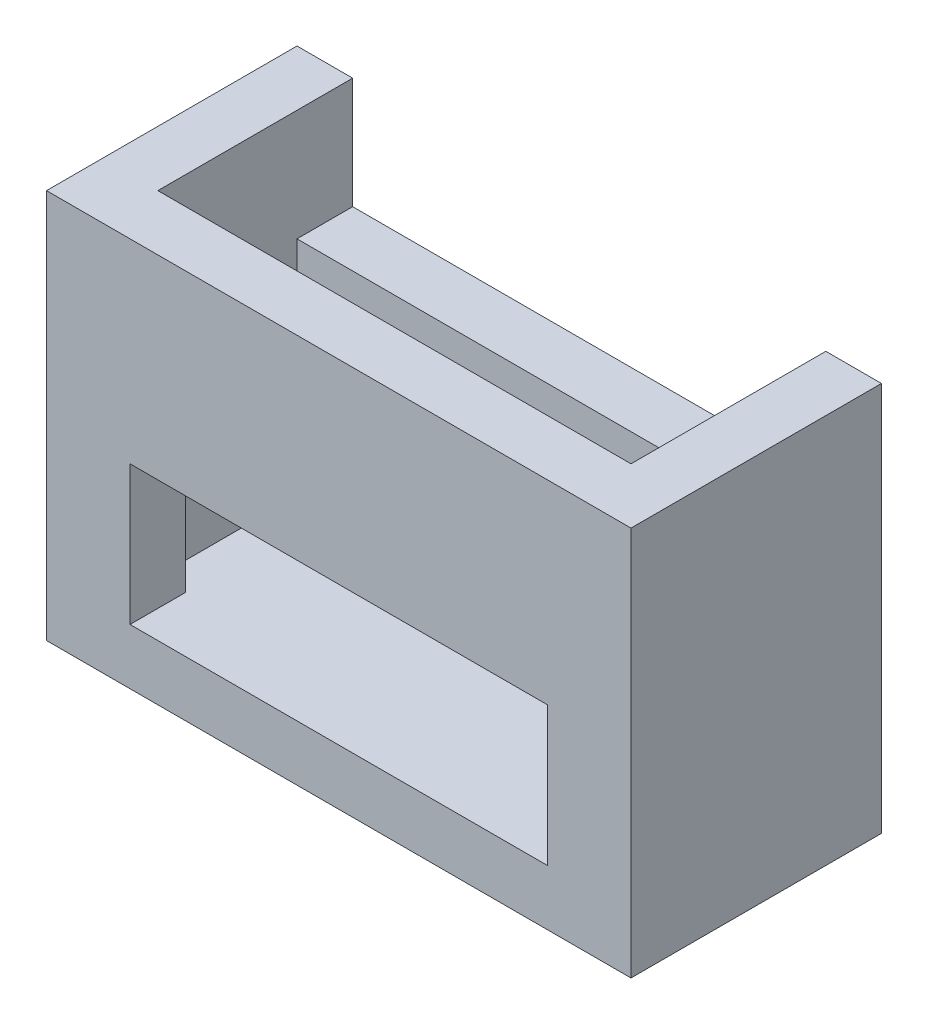
ISO-10303-21;
HEADER;
FILE_DESCRIPTION(('STEP AP214'),'2;1');
FILE_NAME('part.step','',(''),(''),'','','');
FILE_SCHEMA(('AUTOMOTIVE_DESIGN { 1 0 10303 214 1 1 1 1 }'));
ENDSEC;
DATA;
#1=APPLICATION_CONTEXT('core data for automotive mechanical design processes');
#2=APPLICATION_PROTOCOL_DEFINITION('international standard','automotive_design',2000,#1);
#3=PRODUCT_CONTEXT('',#1,'mechanical');
#4=PRODUCT('Part','Part','',(#3));
#5=PRODUCT_RELATED_PRODUCT_CATEGORY('part','',(#4));
#6=PRODUCT_DEFINITION_FORMATION('','',#4);
#7=PRODUCT_DEFINITION_CONTEXT('part definition',#1,'design');
#8=PRODUCT_DEFINITION('design','',#6,#7);
#9=PRODUCT_DEFINITION_SHAPE('','',#8);
#10=(LENGTH_UNIT() NAMED_UNIT(*) SI_UNIT(.MILLI.,.METRE.));
#11=(NAMED_UNIT(*) PLANE_ANGLE_UNIT() SI_UNIT($,.RADIAN.));
#12=(NAMED_UNIT(*) SI_UNIT($,.STERADIAN.) SOLID_ANGLE_UNIT());
#13=UNCERTAINTY_MEASURE_WITH_UNIT(LENGTH_MEASURE(1.E-05),#10,'distance_accuracy_value','');
#14=(GEOMETRIC_REPRESENTATION_CONTEXT(3) GLOBAL_UNCERTAINTY_ASSIGNED_CONTEXT((#13)) GLOBAL_UNIT_ASSIGNED_CONTEXT((#10,
#11,#12)) REPRESENTATION_CONTEXT('',''));
#15=CARTESIAN_POINT('',(0.,0.,0.));
#16=DIRECTION('',(0.,0.,1.));
#17=DIRECTION('',(1.,0.,0.));
#18=AXIS2_PLACEMENT_3D('',#15,#16,#17);
#19=CARTESIAN_POINT('',(7.50000000000001,0.,4.));
#20=DIRECTION('',(1.,0.,0.));
#21=DIRECTION('',(0.,0.,-1.));
#22=AXIS2_PLACEMENT_3D('',#19,#20,#21);
#23=PLANE('',#22);
#24=DIRECTION('',(0.,-1.,0.));
#25=VECTOR('',#24,1.);
#26=CARTESIAN_POINT('',(7.50000000000001,0.,7.));
#27=LINE('',#26,#25);
#28=CARTESIAN_POINT('',(7.50000000000001,0.,7.));
#29=VERTEX_POINT('',#28);
#30=CARTESIAN_POINT('',(7.50000000000001,-5.,7.));
#31=VERTEX_POINT('',#30);
#32=EDGE_CURVE('E270',#29,#31,#27,.T.);
#33=ORIENTED_EDGE('',*,*,#32,.T.);
#34=DIRECTION('',(0.,0.,1.));
#35=VECTOR('',#34,1.);
#36=CARTESIAN_POINT('',(7.50000000000001,-5.,4.));
#37=LINE('',#36,#35);
#38=CARTESIAN_POINT('',(7.50000000000001,-5.,9.));
#39=VERTEX_POINT('',#38);
#40=EDGE_CURVE('E191',#31,#39,#37,.T.);
#41=ORIENTED_EDGE('',*,*,#40,.T.);
#42=DIRECTION('',(0.,1.,0.));
#43=VECTOR('',#42,1.);
#44=CARTESIAN_POINT('',(7.50000000000001,0.,9.));
#45=LINE('',#44,#43);
#46=CARTESIAN_POINT('',(7.50000000000001,0.,9.));
#47=VERTEX_POINT('',#46);
#48=EDGE_CURVE('E254',#39,#47,#45,.T.);
#49=ORIENTED_EDGE('',*,*,#48,.T.);
#50=DIRECTION('',(0.,0.,1.));
#51=VECTOR('',#50,1.);
#52=CARTESIAN_POINT('',(7.50000000000001,0.,4.));
#53=LINE('',#52,#51);
#54=EDGE_CURVE('E185',#29,#47,#53,.T.);
#55=ORIENTED_EDGE('',*,*,#54,.F.);
#56=EDGE_LOOP('',(#33,#41,#49,#55));
#57=FACE_BOUND('',#56,.T.);
#58=ADVANCED_FACE('F39',(#57),#23,.F.);
#59=CARTESIAN_POINT('',(0.,-1.,0.));
#60=DIRECTION('',(0.,1.,0.));
#61=DIRECTION('',(0.,0.,1.));
#62=AXIS2_PLACEMENT_3D('',#59,#60,#61);
#63=PLANE('',#62);
#64=DIRECTION('',(0.,0.,1.));
#65=VECTOR('',#64,1.);
#66=CARTESIAN_POINT('',(-8.5,-1.,0.));
#67=LINE('',#66,#65);
#68=CARTESIAN_POINT('',(-8.5,-1.,2.));
#69=VERTEX_POINT('',#68);
#70=CARTESIAN_POINT('',(-8.5,-1.,4.));
#71=VERTEX_POINT('',#70);
#72=EDGE_CURVE('E285',#69,#71,#67,.T.);
#73=ORIENTED_EDGE('',*,*,#72,.T.);
#74=DIRECTION('',(-1.,0.,0.));
#75=VECTOR('',#74,1.);
#76=CARTESIAN_POINT('',(0.,-1.,4.));
#77=LINE('',#76,#75);
#78=CARTESIAN_POINT('',(8.5,-1.,4.));
#79=VERTEX_POINT('',#78);
#80=EDGE_CURVE('E11',#79,#71,#77,.T.);
#81=ORIENTED_EDGE('',*,*,#80,.F.);
#82=DIRECTION('',(0.,0.,-1.));
#83=VECTOR('',#82,1.);
#84=CARTESIAN_POINT('',(8.5,-1.,0.));
#85=LINE('',#84,#83);
#86=CARTESIAN_POINT('',(8.5,-1.,2.));
#87=VERTEX_POINT('',#86);
#88=EDGE_CURVE('E279',#79,#87,#85,.T.);
#89=ORIENTED_EDGE('',*,*,#88,.T.);
#90=DIRECTION('',(-1.,0.,0.));
#91=VECTOR('',#90,1.);
#92=CARTESIAN_POINT('',(0.,-1.,2.));
#93=LINE('',#92,#91);
#94=EDGE_CURVE('E281',#87,#69,#93,.T.);
#95=ORIENTED_EDGE('',*,*,#94,.T.);
#96=EDGE_LOOP('',(#73,#81,#89,#95));
#97=FACE_BOUND('',#96,.T.);
#98=ADVANCED_FACE('F314',(#97),#63,.T.);
#99=CARTESIAN_POINT('',(0.,0.,4.));
#100=DIRECTION('',(0.,0.,1.));
#101=DIRECTION('',(1.,0.,0.));
#102=AXIS2_PLACEMENT_3D('',#99,#100,#101);
#103=PLANE('',#102);
#104=DIRECTION('',(1.,0.,0.));
#105=VECTOR('',#104,1.);
#106=CARTESIAN_POINT('',(0.,-5.,4.));
#107=LINE('',#106,#105);
#108=CARTESIAN_POINT('',(-8.5,-5.,4.));
#109=VERTEX_POINT('',#108);
#110=CARTESIAN_POINT('',(8.5,-5.,4.));
#111=VERTEX_POINT('',#110);
#112=EDGE_CURVE('E193',#109,#111,#107,.T.);
#113=ORIENTED_EDGE('',*,*,#112,.T.);
#114=DIRECTION('',(0.,1.,0.));
#115=VECTOR('',#114,1.);
#116=CARTESIAN_POINT('',(8.5,-5.,4.));
#117=LINE('',#116,#115);
#118=EDGE_CURVE('E275',#111,#79,#117,.T.);
#119=ORIENTED_EDGE('',*,*,#118,.T.);
#120=ORIENTED_EDGE('',*,*,#80,.T.);
#121=DIRECTION('',(0.,1.,0.));
#122=VECTOR('',#121,1.);
#123=CARTESIAN_POINT('',(-8.5,-5.,4.));
#124=LINE('',#123,#122);
#125=EDGE_CURVE('E289',#109,#71,#124,.T.);
#126=ORIENTED_EDGE('',*,*,#125,.F.);
#127=EDGE_LOOP('',(#113,#119,#120,#126));
#128=FACE_BOUND('',#127,.T.);
#129=ADVANCED_FACE('F311',(#128),#103,.T.);
#130=CARTESIAN_POINT('',(-10.5,7.,9.));
#131=DIRECTION('',(0.,-1.,0.));
#132=DIRECTION('',(0.,0.,-1.));
#133=AXIS2_PLACEMENT_3D('',#130,#131,#132);
#134=PLANE('',#133);
#135=DIRECTION('',(0.,0.,-1.));
#136=VECTOR('',#135,1.);
#137=CARTESIAN_POINT('',(-8.5,7.,0.));
#138=LINE('',#137,#136);
#139=CARTESIAN_POINT('',(-8.5,7.,7.));
#140=VERTEX_POINT('',#139);
#141=CARTESIAN_POINT('',(-8.5,7.,0.));
#142=VERTEX_POINT('',#141);
#143=EDGE_CURVE('E295',#140,#142,#138,.T.);
#144=ORIENTED_EDGE('',*,*,#143,.T.);
#145=DIRECTION('',(-1.,0.,0.));
#146=VECTOR('',#145,1.);
#147=CARTESIAN_POINT('',(-10.5,7.,0.));
#148=LINE('',#147,#146);
#149=CARTESIAN_POINT('',(-10.5,7.,0.));
#150=VERTEX_POINT('',#149);
#151=EDGE_CURVE('E183',#142,#150,#148,.T.);
#152=ORIENTED_EDGE('',*,*,#151,.T.);
#153=DIRECTION('',(0.,0.,-1.));
#154=VECTOR('',#153,1.);
#155=CARTESIAN_POINT('',(-10.5,7.,9.));
#156=LINE('',#155,#154);
#157=CARTESIAN_POINT('',(-10.5,7.,9.));
#158=VERTEX_POINT('',#157);
#159=EDGE_CURVE('E216',#158,#150,#156,.T.);
#160=ORIENTED_EDGE('',*,*,#159,.F.);
#161=DIRECTION('',(-1.,0.,0.));
#162=VECTOR('',#161,1.);
#163=CARTESIAN_POINT('',(-10.5,7.,9.));
#164=LINE('',#163,#162);
#165=CARTESIAN_POINT('',(10.5,7.,9.));
#166=VERTEX_POINT('',#165);
#167=EDGE_CURVE('E197',#166,#158,#164,.T.);
#168=ORIENTED_EDGE('',*,*,#167,.F.);
#169=DIRECTION('',(0.,0.,-1.));
#170=VECTOR('',#169,1.);
#171=CARTESIAN_POINT('',(10.5,7.,9.));
#172=LINE('',#171,#170);
#173=CARTESIAN_POINT('',(10.5,7.,0.));
#174=VERTEX_POINT('',#173);
#175=EDGE_CURVE('E47',#166,#174,#172,.T.);
#176=ORIENTED_EDGE('',*,*,#175,.T.);
#177=CARTESIAN_POINT('',(8.5,7.,0.));
#178=VERTEX_POINT('',#177);
#179=EDGE_CURVE('E205',#174,#178,#148,.T.);
#180=ORIENTED_EDGE('',*,*,#179,.T.);
#181=DIRECTION('',(0.,0.,-1.));
#182=VECTOR('',#181,1.);
#183=CARTESIAN_POINT('',(8.5,7.,0.));
#184=LINE('',#183,#182);
#185=CARTESIAN_POINT('',(8.5,7.,7.));
#186=VERTEX_POINT('',#185);
#187=EDGE_CURVE('E299',#186,#178,#184,.T.);
#188=ORIENTED_EDGE('',*,*,#187,.F.);
#189=DIRECTION('',(1.,0.,0.));
#190=VECTOR('',#189,1.);
#191=CARTESIAN_POINT('',(0.,7.,7.));
#192=LINE('',#191,#190);
#193=EDGE_CURVE('E163',#140,#186,#192,.T.);
#194=ORIENTED_EDGE('',*,*,#193,.F.);
#195=EDGE_LOOP('',(#144,#152,#160,#168,#176,#180,#188,#194));
#196=FACE_BOUND('',#195,.T.);
#197=ADVANCED_FACE('F222',(#196),#134,.F.);
#198=CARTESIAN_POINT('',(0.,0.,0.));
#199=DIRECTION('',(0.,0.,1.));
#200=DIRECTION('',(1.,0.,0.));
#201=AXIS2_PLACEMENT_3D('',#198,#199,#200);
#202=PLANE('',#201);
#203=DIRECTION('',(0.,1.,0.));
#204=VECTOR('',#203,1.);
#205=CARTESIAN_POINT('',(-8.5,3.,0.));
#206=LINE('',#205,#204);
#207=CARTESIAN_POINT('',(-8.5,3.,0.));
#208=VERTEX_POINT('',#207);
#209=EDGE_CURVE('E242',#208,#142,#206,.T.);
#210=ORIENTED_EDGE('',*,*,#209,.F.);
#211=DIRECTION('',(-1.,0.,0.));
#212=VECTOR('',#211,1.);
#213=CARTESIAN_POINT('',(0.,3.,0.));
#214=LINE('',#213,#212);
#215=CARTESIAN_POINT('',(8.5,3.,0.));
#216=VERTEX_POINT('',#215);
#217=EDGE_CURVE('E239',#216,#208,#214,.T.);
#218=ORIENTED_EDGE('',*,*,#217,.F.);
#219=DIRECTION('',(0.,1.,0.));
#220=VECTOR('',#219,1.);
#221=CARTESIAN_POINT('',(8.5,3.,0.));
#222=LINE('',#221,#220);
#223=EDGE_CURVE('E237',#216,#178,#222,.T.);
#224=ORIENTED_EDGE('',*,*,#223,.T.);
#225=ORIENTED_EDGE('',*,*,#179,.F.);
#226=DIRECTION('',(0.,1.,0.));
#227=VECTOR('',#226,1.);
#228=CARTESIAN_POINT('',(10.5,7.,0.));
#229=LINE('',#228,#227);
#230=CARTESIAN_POINT('',(10.5,-7.,0.));
#231=VERTEX_POINT('',#230);
#232=EDGE_CURVE('E179',#231,#174,#229,.T.);
#233=ORIENTED_EDGE('',*,*,#232,.F.);
#234=DIRECTION('',(1.,0.,0.));
#235=VECTOR('',#234,1.);
#236=CARTESIAN_POINT('',(-10.5,-7.,0.));
#237=LINE('',#236,#235);
#238=CARTESIAN_POINT('',(-10.5,-7.,0.));
#239=VERTEX_POINT('',#238);
#240=EDGE_CURVE('E198',#239,#231,#237,.T.);
#241=ORIENTED_EDGE('',*,*,#240,.F.);
#242=DIRECTION('',(0.,-1.,0.));
#243=VECTOR('',#242,1.);
#244=CARTESIAN_POINT('',(-10.5,7.,0.));
#245=LINE('',#244,#243);
#246=EDGE_CURVE('E208',#150,#239,#245,.T.);
#247=ORIENTED_EDGE('',*,*,#246,.F.);
#248=ORIENTED_EDGE('',*,*,#151,.F.);
#249=EDGE_LOOP('',(#210,#218,#224,#225,#233,#241,#247,#248));
#250=FACE_BOUND('',#249,.T.);
#251=ADVANCED_FACE('F232',(#250),#202,.F.);
#252=CARTESIAN_POINT('',(10.5,7.,9.));
#253=DIRECTION('',(-1.,0.,0.));
#254=DIRECTION('',(0.,0.,1.));
#255=AXIS2_PLACEMENT_3D('',#252,#253,#254);
#256=PLANE('',#255);
#257=ORIENTED_EDGE('',*,*,#232,.T.);
#258=ORIENTED_EDGE('',*,*,#175,.F.);
#259=DIRECTION('',(0.,1.,0.));
#260=VECTOR('',#259,1.);
#261=CARTESIAN_POINT('',(10.5,7.,9.));
#262=LINE('',#261,#260);
#263=CARTESIAN_POINT('',(10.5,-7.,9.));
#264=VERTEX_POINT('',#263);
#265=EDGE_CURVE('E194',#264,#166,#262,.T.);
#266=ORIENTED_EDGE('',*,*,#265,.F.);
#267=DIRECTION('',(0.,0.,-1.));
#268=VECTOR('',#267,1.);
#269=CARTESIAN_POINT('',(10.5,-7.,9.));
#270=LINE('',#269,#268);
#271=EDGE_CURVE('E203',#264,#231,#270,.T.);
#272=ORIENTED_EDGE('',*,*,#271,.T.);
#273=EDGE_LOOP('',(#257,#258,#266,#272));
#274=FACE_BOUND('',#273,.T.);
#275=ADVANCED_FACE('F41',(#274),#256,.F.);
#276=CARTESIAN_POINT('',(-10.5,7.,9.));
#277=DIRECTION('',(1.,0.,0.));
#278=DIRECTION('',(0.,1.,0.));
#279=AXIS2_PLACEMENT_3D('',#276,#277,#278);
#280=PLANE('',#279);
#281=ORIENTED_EDGE('',*,*,#246,.T.);
#282=DIRECTION('',(0.,0.,-1.));
#283=VECTOR('',#282,1.);
#284=CARTESIAN_POINT('',(-10.5,-7.,9.));
#285=LINE('',#284,#283);
#286=CARTESIAN_POINT('',(-10.5,-7.,9.));
#287=VERTEX_POINT('',#286);
#288=EDGE_CURVE('E213',#287,#239,#285,.T.);
#289=ORIENTED_EDGE('',*,*,#288,.F.);
#290=DIRECTION('',(0.,-1.,0.));
#291=VECTOR('',#290,1.);
#292=CARTESIAN_POINT('',(-10.5,7.,9.));
#293=LINE('',#292,#291);
#294=EDGE_CURVE('E200',#158,#287,#293,.T.);
#295=ORIENTED_EDGE('',*,*,#294,.F.);
#296=ORIENTED_EDGE('',*,*,#159,.T.);
#297=EDGE_LOOP('',(#281,#289,#295,#296));
#298=FACE_BOUND('',#297,.T.);
#299=ADVANCED_FACE('F321',(#298),#280,.F.);
#300=CARTESIAN_POINT('',(-10.5,-7.,9.));
#301=DIRECTION('',(0.,1.,0.));
#302=DIRECTION('',(0.,0.,1.));
#303=AXIS2_PLACEMENT_3D('',#300,#301,#302);
#304=PLANE('',#303);
#305=ORIENTED_EDGE('',*,*,#240,.T.);
#306=ORIENTED_EDGE('',*,*,#271,.F.);
#307=DIRECTION('',(1.,0.,0.));
#308=VECTOR('',#307,1.);
#309=CARTESIAN_POINT('',(-10.5,-7.,9.));
#310=LINE('',#309,#308);
#311=EDGE_CURVE('E202',#287,#264,#310,.T.);
#312=ORIENTED_EDGE('',*,*,#311,.F.);
#313=ORIENTED_EDGE('',*,*,#288,.T.);
#314=EDGE_LOOP('',(#305,#306,#312,#313));
#315=FACE_BOUND('',#314,.T.);
#316=ADVANCED_FACE('F325',(#315),#304,.F.);
#317=CARTESIAN_POINT('',(0.,0.,9.));
#318=DIRECTION('',(0.,0.,1.));
#319=DIRECTION('',(1.,0.,0.));
#320=AXIS2_PLACEMENT_3D('',#317,#318,#319);
#321=PLANE('',#320);
#322=DIRECTION('',(1.,0.,0.));
#323=VECTOR('',#322,1.);
#324=CARTESIAN_POINT('',(0.,-5.,9.));
#325=LINE('',#324,#323);
#326=CARTESIAN_POINT('',(-7.49999999999999,-5.,9.));
#327=VERTEX_POINT('',#326);
#328=EDGE_CURVE('E252',#327,#39,#325,.T.);
#329=ORIENTED_EDGE('',*,*,#328,.F.);
#330=DIRECTION('',(0.,1.,0.));
#331=VECTOR('',#330,1.);
#332=CARTESIAN_POINT('',(-7.49999999999999,0.,9.));
#333=LINE('',#332,#331);
#334=CARTESIAN_POINT('',(-7.49999999999999,0.,9.));
#335=VERTEX_POINT('',#334);
#336=EDGE_CURVE('E177',#327,#335,#333,.T.);
#337=ORIENTED_EDGE('',*,*,#336,.T.);
#338=DIRECTION('',(1.,0.,0.));
#339=VECTOR('',#338,1.);
#340=CARTESIAN_POINT('',(0.,0.,9.));
#341=LINE('',#340,#339);
#342=EDGE_CURVE('E256',#335,#47,#341,.T.);
#343=ORIENTED_EDGE('',*,*,#342,.T.);
#344=ORIENTED_EDGE('',*,*,#48,.F.);
#345=EDGE_LOOP('',(#329,#337,#343,#344));
#346=FACE_BOUND('',#345,.T.);
#347=ORIENTED_EDGE('',*,*,#265,.T.);
#348=ORIENTED_EDGE('',*,*,#167,.T.);
#349=ORIENTED_EDGE('',*,*,#294,.T.);
#350=ORIENTED_EDGE('',*,*,#311,.T.);
#351=EDGE_LOOP('',(#347,#348,#349,#350));
#352=FACE_BOUND('',#351,.T.);
#353=ADVANCED_FACE('F261',(#346,#352),#321,.T.);
#354=CARTESIAN_POINT('',(0.,-5.,4.));
#355=DIRECTION('',(0.,-1.,0.));
#356=DIRECTION('',(0.,0.,-1.));
#357=AXIS2_PLACEMENT_3D('',#354,#355,#356);
#358=PLANE('',#357);
#359=ORIENTED_EDGE('',*,*,#328,.T.);
#360=ORIENTED_EDGE('',*,*,#40,.F.);
#361=DIRECTION('',(-1.,0.,0.));
#362=VECTOR('',#361,1.);
#363=CARTESIAN_POINT('',(8.5,-5.,7.));
#364=LINE('',#363,#362);
#365=CARTESIAN_POINT('',(8.5,-5.,7.));
#366=VERTEX_POINT('',#365);
#367=EDGE_CURVE('E173',#366,#31,#364,.T.);
#368=ORIENTED_EDGE('',*,*,#367,.F.);
#369=DIRECTION('',(0.,0.,-1.));
#370=VECTOR('',#369,1.);
#371=CARTESIAN_POINT('',(8.5,-5.,7.));
#372=LINE('',#371,#370);
#373=EDGE_CURVE('E273',#366,#111,#372,.T.);
#374=ORIENTED_EDGE('',*,*,#373,.T.);
#375=ORIENTED_EDGE('',*,*,#112,.F.);
#376=DIRECTION('',(0.,0.,-1.));
#377=VECTOR('',#376,1.);
#378=CARTESIAN_POINT('',(-8.5,-5.,7.));
#379=LINE('',#378,#377);
#380=CARTESIAN_POINT('',(-8.5,-5.,7.));
#381=VERTEX_POINT('',#380);
#382=EDGE_CURVE('E172',#381,#109,#379,.T.);
#383=ORIENTED_EDGE('',*,*,#382,.F.);
#384=DIRECTION('',(1.,0.,0.));
#385=VECTOR('',#384,1.);
#386=CARTESIAN_POINT('',(-8.5,-5.,7.));
#387=LINE('',#386,#385);
#388=CARTESIAN_POINT('',(-7.49999999999999,-5.,7.));
#389=VERTEX_POINT('',#388);
#390=EDGE_CURVE('E157',#381,#389,#387,.T.);
#391=ORIENTED_EDGE('',*,*,#390,.T.);
#392=DIRECTION('',(0.,0.,1.));
#393=VECTOR('',#392,1.);
#394=CARTESIAN_POINT('',(-7.49999999999999,-5.,4.));
#395=LINE('',#394,#393);
#396=EDGE_CURVE('E169',#389,#327,#395,.T.);
#397=ORIENTED_EDGE('',*,*,#396,.T.);
#398=EDGE_LOOP('',(#359,#360,#368,#374,#375,#383,#391,#397));
#399=FACE_BOUND('',#398,.T.);
#400=ADVANCED_FACE('F168',(#399),#358,.F.);
#401=CARTESIAN_POINT('',(-7.49999999999999,0.,4.));
#402=DIRECTION('',(1.,0.,0.));
#403=DIRECTION('',(0.,0.,-1.));
#404=AXIS2_PLACEMENT_3D('',#401,#402,#403);
#405=PLANE('',#404);
#406=ORIENTED_EDGE('',*,*,#396,.F.);
#407=DIRECTION('',(0.,-1.,0.));
#408=VECTOR('',#407,1.);
#409=CARTESIAN_POINT('',(-7.49999999999999,0.,7.));
#410=LINE('',#409,#408);
#411=CARTESIAN_POINT('',(-7.49999999999999,0.,7.));
#412=VERTEX_POINT('',#411);
#413=EDGE_CURVE('E153',#412,#389,#410,.T.);
#414=ORIENTED_EDGE('',*,*,#413,.F.);
#415=DIRECTION('',(0.,0.,1.));
#416=VECTOR('',#415,1.);
#417=CARTESIAN_POINT('',(-7.49999999999999,0.,4.));
#418=LINE('',#417,#416);
#419=EDGE_CURVE('E180',#412,#335,#418,.T.);
#420=ORIENTED_EDGE('',*,*,#419,.T.);
#421=ORIENTED_EDGE('',*,*,#336,.F.);
#422=EDGE_LOOP('',(#406,#414,#420,#421));
#423=FACE_BOUND('',#422,.T.);
#424=ADVANCED_FACE('F175',(#423),#405,.T.);
#425=CARTESIAN_POINT('',(0.,0.,4.));
#426=DIRECTION('',(0.,-1.,0.));
#427=DIRECTION('',(0.,0.,-1.));
#428=AXIS2_PLACEMENT_3D('',#425,#426,#427);
#429=PLANE('',#428);
#430=DIRECTION('',(-1.,0.,0.));
#431=VECTOR('',#430,1.);
#432=CARTESIAN_POINT('',(0.,0.,7.));
#433=LINE('',#432,#431);
#434=EDGE_CURVE('E159',#29,#412,#433,.T.);
#435=ORIENTED_EDGE('',*,*,#434,.F.);
#436=ORIENTED_EDGE('',*,*,#54,.T.);
#437=ORIENTED_EDGE('',*,*,#342,.F.);
#438=ORIENTED_EDGE('',*,*,#419,.F.);
#439=EDGE_LOOP('',(#435,#436,#437,#438));
#440=FACE_BOUND('',#439,.T.);
#441=ADVANCED_FACE('F344',(#440),#429,.T.);
#442=CARTESIAN_POINT('',(0.,3.,7.));
#443=DIRECTION('',(0.,0.,1.));
#444=DIRECTION('',(1.,0.,0.));
#445=AXIS2_PLACEMENT_3D('',#442,#443,#444);
#446=PLANE('',#445);
#447=ORIENTED_EDGE('',*,*,#193,.T.);
#448=DIRECTION('',(0.,1.,0.));
#449=VECTOR('',#448,1.);
#450=CARTESIAN_POINT('',(8.5,3.,7.));
#451=LINE('',#450,#449);
#452=EDGE_CURVE('E243',#366,#186,#451,.T.);
#453=ORIENTED_EDGE('',*,*,#452,.F.);
#454=ORIENTED_EDGE('',*,*,#367,.T.);
#455=ORIENTED_EDGE('',*,*,#32,.F.);
#456=ORIENTED_EDGE('',*,*,#434,.T.);
#457=ORIENTED_EDGE('',*,*,#413,.T.);
#458=ORIENTED_EDGE('',*,*,#390,.F.);
#459=DIRECTION('',(0.,1.,0.));
#460=VECTOR('',#459,1.);
#461=CARTESIAN_POINT('',(-8.5,3.,7.));
#462=LINE('',#461,#460);
#463=EDGE_CURVE('E245',#381,#140,#462,.T.);
#464=ORIENTED_EDGE('',*,*,#463,.T.);
#465=EDGE_LOOP('',(#447,#453,#454,#455,#456,#457,#458,#464));
#466=FACE_BOUND('',#465,.T.);
#467=ADVANCED_FACE('F156',(#466),#446,.F.);
#468=CARTESIAN_POINT('',(-8.5,3.,0.));
#469=DIRECTION('',(1.,0.,0.));
#470=DIRECTION('',(0.,0.,-1.));
#471=AXIS2_PLACEMENT_3D('',#468,#469,#470);
#472=PLANE('',#471);
#473=ORIENTED_EDGE('',*,*,#143,.F.);
#474=ORIENTED_EDGE('',*,*,#463,.F.);
#475=ORIENTED_EDGE('',*,*,#382,.T.);
#476=ORIENTED_EDGE('',*,*,#125,.T.);
#477=ORIENTED_EDGE('',*,*,#72,.F.);
#478=DIRECTION('',(0.,1.,0.));
#479=VECTOR('',#478,1.);
#480=CARTESIAN_POINT('',(-8.5,-1.,2.));
#481=LINE('',#480,#479);
#482=CARTESIAN_POINT('',(-8.5,3.,2.));
#483=VERTEX_POINT('',#482);
#484=EDGE_CURVE('E271',#69,#483,#481,.T.);
#485=ORIENTED_EDGE('',*,*,#484,.T.);
#486=DIRECTION('',(0.,0.,-1.));
#487=VECTOR('',#486,1.);
#488=CARTESIAN_POINT('',(-8.5,3.,0.));
#489=LINE('',#488,#487);
#490=EDGE_CURVE('E247',#483,#208,#489,.T.);
#491=ORIENTED_EDGE('',*,*,#490,.T.);
#492=ORIENTED_EDGE('',*,*,#209,.T.);
#493=EDGE_LOOP('',(#473,#474,#475,#476,#477,#485,#491,#492));
#494=FACE_BOUND('',#493,.T.);
#495=ADVANCED_FACE('F304',(#494),#472,.T.);
#496=CARTESIAN_POINT('',(8.5,3.,0.));
#497=DIRECTION('',(1.,0.,0.));
#498=DIRECTION('',(0.,0.,-1.));
#499=AXIS2_PLACEMENT_3D('',#496,#497,#498);
#500=PLANE('',#499);
#501=ORIENTED_EDGE('',*,*,#187,.T.);
#502=ORIENTED_EDGE('',*,*,#223,.F.);
#503=DIRECTION('',(0.,0.,-1.));
#504=VECTOR('',#503,1.);
#505=CARTESIAN_POINT('',(8.5,3.,0.));
#506=LINE('',#505,#504);
#507=CARTESIAN_POINT('',(8.5,3.,2.));
#508=VERTEX_POINT('',#507);
#509=EDGE_CURVE('E293',#508,#216,#506,.T.);
#510=ORIENTED_EDGE('',*,*,#509,.F.);
#511=DIRECTION('',(0.,1.,0.));
#512=VECTOR('',#511,1.);
#513=CARTESIAN_POINT('',(8.5,-1.,2.));
#514=LINE('',#513,#512);
#515=EDGE_CURVE('E60',#87,#508,#514,.T.);
#516=ORIENTED_EDGE('',*,*,#515,.F.);
#517=ORIENTED_EDGE('',*,*,#88,.F.);
#518=ORIENTED_EDGE('',*,*,#118,.F.);
#519=ORIENTED_EDGE('',*,*,#373,.F.);
#520=ORIENTED_EDGE('',*,*,#452,.T.);
#521=EDGE_LOOP('',(#501,#502,#510,#516,#517,#518,#519,#520));
#522=FACE_BOUND('',#521,.T.);
#523=ADVANCED_FACE('F306',(#522),#500,.F.);
#524=CARTESIAN_POINT('',(0.,3.,0.));
#525=DIRECTION('',(0.,1.,0.));
#526=DIRECTION('',(0.,0.,1.));
#527=AXIS2_PLACEMENT_3D('',#524,#525,#526);
#528=PLANE('',#527);
#529=DIRECTION('',(-1.,0.,0.));
#530=VECTOR('',#529,1.);
#531=CARTESIAN_POINT('',(0.,3.,2.));
#532=LINE('',#531,#530);
#533=EDGE_CURVE('E282',#508,#483,#532,.T.);
#534=ORIENTED_EDGE('',*,*,#533,.F.);
#535=ORIENTED_EDGE('',*,*,#509,.T.);
#536=ORIENTED_EDGE('',*,*,#217,.T.);
#537=ORIENTED_EDGE('',*,*,#490,.F.);
#538=EDGE_LOOP('',(#534,#535,#536,#537));
#539=FACE_BOUND('',#538,.T.);
#540=ADVANCED_FACE('F318',(#539),#528,.T.);
#541=CARTESIAN_POINT('',(0.,-1.,2.));
#542=DIRECTION('',(0.,0.,-1.));
#543=DIRECTION('',(-1.,0.,0.));
#544=AXIS2_PLACEMENT_3D('',#541,#542,#543);
#545=PLANE('',#544);
#546=ORIENTED_EDGE('',*,*,#533,.T.);
#547=ORIENTED_EDGE('',*,*,#484,.F.);
#548=ORIENTED_EDGE('',*,*,#94,.F.);
#549=ORIENTED_EDGE('',*,*,#515,.T.);
#550=EDGE_LOOP('',(#546,#547,#548,#549));
#551=FACE_BOUND('',#550,.T.);
#552=ADVANCED_FACE('F316',(#551),#545,.F.);
#553=CLOSED_SHELL('',(#58,#98,#129,#197,#251,#275,#299,#316,#353,#400,#424,#441,#467,#495,#523,
#540,#552));
#554=MANIFOLD_SOLID_BREP('B2',#553);
#555=ADVANCED_BREP_SHAPE_REPRESENTATION('',(#18,#554),#14);
#556=SHAPE_DEFINITION_REPRESENTATION(#9,#555);
ENDSEC;
END-ISO-10303-21;
